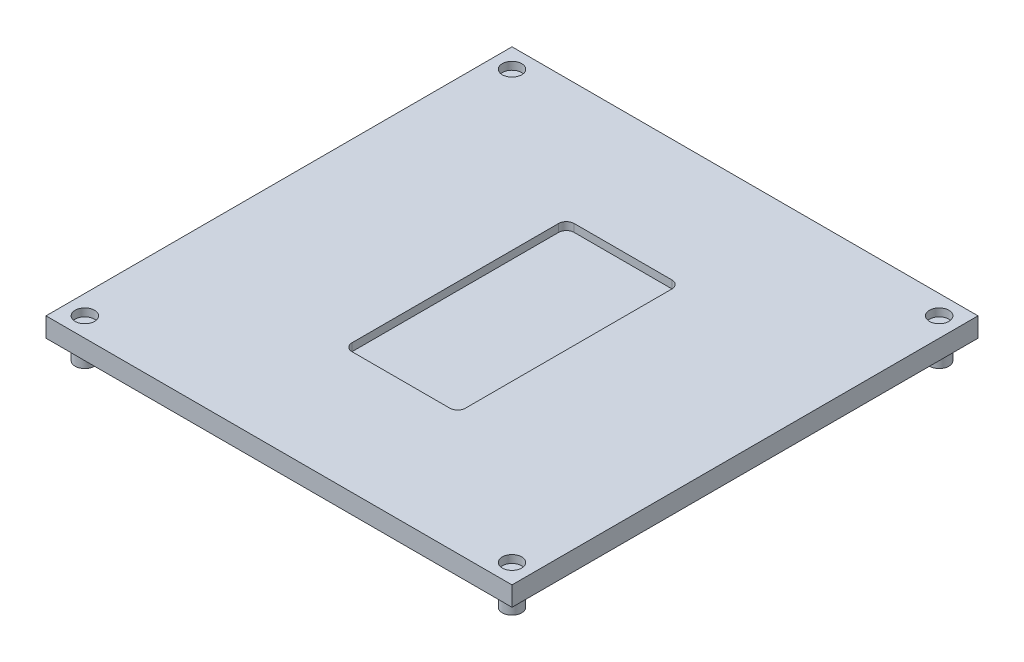
ISO-10303-21;
HEADER;
FILE_DESCRIPTION(('STEP AP214'),'2;1');
FILE_NAME('part.step','',(''),(''),'','','');
FILE_SCHEMA(('AUTOMOTIVE_DESIGN { 1 0 10303 214 1 1 1 1 }'));
ENDSEC;
DATA;
#1=APPLICATION_CONTEXT('core data for automotive mechanical design processes');
#2=APPLICATION_PROTOCOL_DEFINITION('international standard','automotive_design',2000,#1);
#3=PRODUCT_CONTEXT('',#1,'mechanical');
#4=PRODUCT('Part','Part','',(#3));
#5=PRODUCT_RELATED_PRODUCT_CATEGORY('part','',(#4));
#6=PRODUCT_DEFINITION_FORMATION('','',#4);
#7=PRODUCT_DEFINITION_CONTEXT('part definition',#1,'design');
#8=PRODUCT_DEFINITION('design','',#6,#7);
#9=PRODUCT_DEFINITION_SHAPE('','',#8);
#10=(LENGTH_UNIT() NAMED_UNIT(*) SI_UNIT(.MILLI.,.METRE.));
#11=(NAMED_UNIT(*) PLANE_ANGLE_UNIT() SI_UNIT($,.RADIAN.));
#12=(NAMED_UNIT(*) SI_UNIT($,.STERADIAN.) SOLID_ANGLE_UNIT());
#13=UNCERTAINTY_MEASURE_WITH_UNIT(LENGTH_MEASURE(1.E-05),#10,'distance_accuracy_value','');
#14=(GEOMETRIC_REPRESENTATION_CONTEXT(3) GLOBAL_UNCERTAINTY_ASSIGNED_CONTEXT((#13)) GLOBAL_UNIT_ASSIGNED_CONTEXT((#10,
#11,#12)) REPRESENTATION_CONTEXT('',''));
#15=CARTESIAN_POINT('',(0.,0.,0.));
#16=DIRECTION('',(0.,0.,1.));
#17=DIRECTION('',(1.,0.,0.));
#18=AXIS2_PLACEMENT_3D('',#15,#16,#17);
#19=CARTESIAN_POINT('',(17.2862696629214,3.81,8.9527865168539));
#20=DIRECTION('',(0.,1.,0.));
#21=DIRECTION('',(0.,0.,1.));
#22=AXIS2_PLACEMENT_3D('',#19,#20,#21);
#23=CYLINDRICAL_SURFACE('',#22,2.54);
#24=DIRECTION('',(0.,1.,0.));
#25=VECTOR('',#24,1.);
#26=CARTESIAN_POINT('',(19.8262696629214,3.81,8.9527865168539));
#27=LINE('',#26,#25);
#28=CARTESIAN_POINT('',(19.8262696629214,3.81,8.9527865168539));
#29=VERTEX_POINT('',#28);
#30=CARTESIAN_POINT('',(19.8262696629214,6.35,8.9527865168539));
#31=VERTEX_POINT('',#30);
#32=EDGE_CURVE('E204',#29,#31,#27,.T.);
#33=ORIENTED_EDGE('',*,*,#32,.F.);
#34=CARTESIAN_POINT('',(17.2862696629214,3.81,8.9527865168539));
#35=DIRECTION('',(0.,-1.,0.));
#36=DIRECTION('',(0.,0.,-1.));
#37=AXIS2_PLACEMENT_3D('',#34,#35,#36);
#38=CIRCLE('',#37,2.54);
#39=CARTESIAN_POINT('',(17.2862696629214,3.81,11.4927865168539));
#40=VERTEX_POINT('',#39);
#41=EDGE_CURVE('E49',#40,#29,#38,.F.);
#42=ORIENTED_EDGE('',*,*,#41,.F.);
#43=DIRECTION('',(0.,1.,0.));
#44=VECTOR('',#43,1.);
#45=CARTESIAN_POINT('',(17.2862696629214,3.81,11.4927865168539));
#46=LINE('',#45,#44);
#47=CARTESIAN_POINT('',(17.2862696629214,6.35,11.4927865168539));
#48=VERTEX_POINT('',#47);
#49=EDGE_CURVE('E208',#48,#40,#46,.F.);
#50=ORIENTED_EDGE('',*,*,#49,.F.);
#51=CARTESIAN_POINT('',(17.2862696629214,6.35,8.9527865168539));
#52=DIRECTION('',(0.,-1.,0.));
#53=DIRECTION('',(0.,0.,-1.));
#54=AXIS2_PLACEMENT_3D('',#51,#52,#53);
#55=CIRCLE('',#54,2.54);
#56=EDGE_CURVE('E11',#48,#31,#55,.F.);
#57=ORIENTED_EDGE('',*,*,#56,.T.);
#58=EDGE_LOOP('',(#33,#42,#50,#57));
#59=FACE_BOUND('',#58,.T.);
#60=ADVANCED_FACE('F41',(#59),#23,.F.);
#61=CARTESIAN_POINT('',(-14.7177303370786,3.81,8.9527865168539));
#62=DIRECTION('',(0.,1.,0.));
#63=DIRECTION('',(0.,0.,1.));
#64=AXIS2_PLACEMENT_3D('',#61,#62,#63);
#65=CYLINDRICAL_SURFACE('',#64,2.54);
#66=DIRECTION('',(0.,-1.,0.));
#67=VECTOR('',#66,1.);
#68=CARTESIAN_POINT('',(-17.2577303370786,3.81,8.9527865168539));
#69=LINE('',#68,#67);
#70=CARTESIAN_POINT('',(-17.2577303370786,6.35,8.9527865168539));
#71=VERTEX_POINT('',#70);
#72=CARTESIAN_POINT('',(-17.2577303370786,3.81,8.9527865168539));
#73=VERTEX_POINT('',#72);
#74=EDGE_CURVE('E190',#71,#73,#69,.T.);
#75=ORIENTED_EDGE('',*,*,#74,.F.);
#76=CARTESIAN_POINT('',(-14.7177303370786,6.35,8.9527865168539));
#77=DIRECTION('',(0.,-1.,0.));
#78=DIRECTION('',(0.,0.,-1.));
#79=AXIS2_PLACEMENT_3D('',#76,#77,#78);
#80=CIRCLE('',#79,2.54);
#81=CARTESIAN_POINT('',(-14.7177303370786,6.35,11.4927865168539));
#82=VERTEX_POINT('',#81);
#83=EDGE_CURVE('E201',#71,#82,#80,.F.);
#84=ORIENTED_EDGE('',*,*,#83,.T.);
#85=DIRECTION('',(0.,-1.,0.));
#86=VECTOR('',#85,1.);
#87=CARTESIAN_POINT('',(-14.7177303370786,3.81,11.4927865168539));
#88=LINE('',#87,#86);
#89=CARTESIAN_POINT('',(-14.7177303370786,3.81,11.4927865168539));
#90=VERTEX_POINT('',#89);
#91=EDGE_CURVE('E194',#90,#82,#88,.F.);
#92=ORIENTED_EDGE('',*,*,#91,.F.);
#93=CARTESIAN_POINT('',(-14.7177303370786,3.81,8.9527865168539));
#94=DIRECTION('',(0.,-1.,0.));
#95=DIRECTION('',(0.,0.,-1.));
#96=AXIS2_PLACEMENT_3D('',#93,#94,#95);
#97=CIRCLE('',#96,2.54);
#98=EDGE_CURVE('E198',#73,#90,#97,.F.);
#99=ORIENTED_EDGE('',*,*,#98,.F.);
#100=EDGE_LOOP('',(#75,#84,#92,#99));
#101=FACE_BOUND('',#100,.T.);
#102=ADVANCED_FACE('F351',(#101),#65,.F.);
#103=CARTESIAN_POINT('',(17.2862696629213,3.81,-58.6112134831461));
#104=DIRECTION('',(0.,-1.,0.));
#105=DIRECTION('',(0.,0.,-1.));
#106=AXIS2_PLACEMENT_3D('',#103,#104,#105);
#107=CYLINDRICAL_SURFACE('',#106,2.54);
#108=DIRECTION('',(0.,1.,0.));
#109=VECTOR('',#108,1.);
#110=CARTESIAN_POINT('',(17.2862696629213,3.81,-61.1512134831461));
#111=LINE('',#110,#109);
#112=CARTESIAN_POINT('',(17.2862696629213,3.81,-61.1512134831461));
#113=VERTEX_POINT('',#112);
#114=CARTESIAN_POINT('',(17.2862696629213,6.35,-61.1512134831461));
#115=VERTEX_POINT('',#114);
#116=EDGE_CURVE('E176',#113,#115,#111,.T.);
#117=ORIENTED_EDGE('',*,*,#116,.F.);
#118=CARTESIAN_POINT('',(17.2862696629213,3.81,-58.6112134831461));
#119=DIRECTION('',(0.,-1.,0.));
#120=DIRECTION('',(0.,0.,-1.));
#121=AXIS2_PLACEMENT_3D('',#118,#119,#120);
#122=CIRCLE('',#121,2.54);
#123=CARTESIAN_POINT('',(19.8262696629213,3.81,-58.6112134831461));
#124=VERTEX_POINT('',#123);
#125=EDGE_CURVE('E184',#124,#113,#122,.F.);
#126=ORIENTED_EDGE('',*,*,#125,.F.);
#127=DIRECTION('',(0.,1.,0.));
#128=VECTOR('',#127,1.);
#129=CARTESIAN_POINT('',(19.8262696629213,3.81,-58.6112134831461));
#130=LINE('',#129,#128);
#131=CARTESIAN_POINT('',(19.8262696629213,6.35,-58.6112134831461));
#132=VERTEX_POINT('',#131);
#133=EDGE_CURVE('E180',#132,#124,#130,.F.);
#134=ORIENTED_EDGE('',*,*,#133,.F.);
#135=CARTESIAN_POINT('',(17.2862696629213,6.35,-58.6112134831461));
#136=DIRECTION('',(0.,-1.,0.));
#137=DIRECTION('',(0.,0.,-1.));
#138=AXIS2_PLACEMENT_3D('',#135,#136,#137);
#139=CIRCLE('',#138,2.54);
#140=EDGE_CURVE('E187',#132,#115,#139,.F.);
#141=ORIENTED_EDGE('',*,*,#140,.T.);
#142=EDGE_LOOP('',(#117,#126,#134,#141));
#143=FACE_BOUND('',#142,.T.);
#144=ADVANCED_FACE('F355',(#143),#107,.F.);
#145=CARTESIAN_POINT('',(-14.7177303370786,3.81,-58.6112134831461));
#146=DIRECTION('',(0.,-1.,0.));
#147=DIRECTION('',(0.,0.,-1.));
#148=AXIS2_PLACEMENT_3D('',#145,#146,#147);
#149=CYLINDRICAL_SURFACE('',#148,2.54);
#150=DIRECTION('',(0.,-1.,0.));
#151=VECTOR('',#150,1.);
#152=CARTESIAN_POINT('',(-14.7177303370786,3.81,-61.1512134831461));
#153=LINE('',#152,#151);
#154=CARTESIAN_POINT('',(-14.7177303370786,6.35,-61.1512134831461));
#155=VERTEX_POINT('',#154);
#156=CARTESIAN_POINT('',(-14.7177303370786,3.81,-61.1512134831461));
#157=VERTEX_POINT('',#156);
#158=EDGE_CURVE('E156',#155,#157,#153,.T.);
#159=ORIENTED_EDGE('',*,*,#158,.F.);
#160=CARTESIAN_POINT('',(-14.7177303370786,6.35,-58.6112134831461));
#161=DIRECTION('',(0.,-1.,0.));
#162=DIRECTION('',(0.,0.,-1.));
#163=AXIS2_PLACEMENT_3D('',#160,#161,#162);
#164=CIRCLE('',#163,2.54);
#165=CARTESIAN_POINT('',(-17.2577303370786,6.35,-58.6112134831461));
#166=VERTEX_POINT('',#165);
#167=EDGE_CURVE('E173',#155,#166,#164,.F.);
#168=ORIENTED_EDGE('',*,*,#167,.T.);
#169=DIRECTION('',(0.,-1.,0.));
#170=VECTOR('',#169,1.);
#171=CARTESIAN_POINT('',(-17.2577303370786,3.81,-58.6112134831461));
#172=LINE('',#171,#170);
#173=CARTESIAN_POINT('',(-17.2577303370786,3.81,-58.6112134831461));
#174=VERTEX_POINT('',#173);
#175=EDGE_CURVE('E161',#174,#166,#172,.F.);
#176=ORIENTED_EDGE('',*,*,#175,.F.);
#177=CARTESIAN_POINT('',(-14.7177303370786,3.81,-58.6112134831461));
#178=DIRECTION('',(0.,-1.,0.));
#179=DIRECTION('',(0.,0.,-1.));
#180=AXIS2_PLACEMENT_3D('',#177,#178,#179);
#181=CIRCLE('',#180,2.54);
#182=EDGE_CURVE('E170',#157,#174,#181,.F.);
#183=ORIENTED_EDGE('',*,*,#182,.F.);
#184=EDGE_LOOP('',(#159,#168,#176,#183));
#185=FACE_BOUND('',#184,.T.);
#186=ADVANCED_FACE('F360',(#185),#149,.F.);
#187=CARTESIAN_POINT('',(-74.9157303370786,6.35,-101.029213483146));
#188=DIRECTION('',(1.,0.,0.));
#189=DIRECTION('',(0.,0.,-1.));
#190=AXIS2_PLACEMENT_3D('',#187,#188,#189);
#191=PLANE('',#190);
#192=DIRECTION('',(0.,0.,1.));
#193=VECTOR('',#192,1.);
#194=CARTESIAN_POINT('',(-74.9157303370786,0.,-101.029213483146));
#195=LINE('',#194,#193);
#196=CARTESIAN_POINT('',(-74.9157303370786,0.,-101.029213483146));
#197=VERTEX_POINT('',#196);
#198=CARTESIAN_POINT('',(-74.9157303370786,0.,51.3707865168539));
#199=VERTEX_POINT('',#198);
#200=EDGE_CURVE('E154',#197,#199,#195,.T.);
#201=ORIENTED_EDGE('',*,*,#200,.T.);
#202=DIRECTION('',(0.,-1.,0.));
#203=VECTOR('',#202,1.);
#204=CARTESIAN_POINT('',(-74.9157303370786,6.35,51.3707865168539));
#205=LINE('',#204,#203);
#206=CARTESIAN_POINT('',(-74.9157303370786,6.35,51.3707865168539));
#207=VERTEX_POINT('',#206);
#208=EDGE_CURVE('E132',#207,#199,#205,.T.);
#209=ORIENTED_EDGE('',*,*,#208,.F.);
#210=DIRECTION('',(0.,0.,1.));
#211=VECTOR('',#210,1.);
#212=CARTESIAN_POINT('',(-74.9157303370786,6.35,-101.029213483146));
#213=LINE('',#212,#211);
#214=CARTESIAN_POINT('',(-74.9157303370786,6.35,-101.029213483146));
#215=VERTEX_POINT('',#214);
#216=EDGE_CURVE('E140',#215,#207,#213,.T.);
#217=ORIENTED_EDGE('',*,*,#216,.F.);
#218=DIRECTION('',(0.,-1.,0.));
#219=VECTOR('',#218,1.);
#220=CARTESIAN_POINT('',(-74.9157303370786,6.35,-101.029213483146));
#221=LINE('',#220,#219);
#222=EDGE_CURVE('E319',#215,#197,#221,.T.);
#223=ORIENTED_EDGE('',*,*,#222,.T.);
#224=EDGE_LOOP('',(#201,#209,#217,#223));
#225=FACE_BOUND('',#224,.T.);
#226=ADVANCED_FACE('F152',(#225),#191,.F.);
#227=CARTESIAN_POINT('',(77.4842696629214,6.35,51.3707865168539));
#228=DIRECTION('',(0.,0.,-1.));
#229=DIRECTION('',(-1.,0.,0.));
#230=AXIS2_PLACEMENT_3D('',#227,#228,#229);
#231=PLANE('',#230);
#232=DIRECTION('',(1.,0.,0.));
#233=VECTOR('',#232,1.);
#234=CARTESIAN_POINT('',(77.4842696629214,0.,51.3707865168539));
#235=LINE('',#234,#233);
#236=CARTESIAN_POINT('',(77.4842696629214,0.,51.3707865168539));
#237=VERTEX_POINT('',#236);
#238=EDGE_CURVE('E322',#199,#237,#235,.T.);
#239=ORIENTED_EDGE('',*,*,#238,.T.);
#240=DIRECTION('',(0.,-1.,0.));
#241=VECTOR('',#240,1.);
#242=CARTESIAN_POINT('',(77.4842696629214,6.35,51.3707865168539));
#243=LINE('',#242,#241);
#244=CARTESIAN_POINT('',(77.4842696629214,6.35,51.3707865168539));
#245=VERTEX_POINT('',#244);
#246=EDGE_CURVE('E135',#245,#237,#243,.T.);
#247=ORIENTED_EDGE('',*,*,#246,.F.);
#248=DIRECTION('',(1.,0.,0.));
#249=VECTOR('',#248,1.);
#250=CARTESIAN_POINT('',(77.4842696629214,6.35,51.3707865168539));
#251=LINE('',#250,#249);
#252=EDGE_CURVE('E128',#207,#245,#251,.T.);
#253=ORIENTED_EDGE('',*,*,#252,.F.);
#254=ORIENTED_EDGE('',*,*,#208,.T.);
#255=EDGE_LOOP('',(#239,#247,#253,#254));
#256=FACE_BOUND('',#255,.T.);
#257=ADVANCED_FACE('F130',(#256),#231,.F.);
#258=CARTESIAN_POINT('',(77.4842696629214,6.35,-101.029213483146));
#259=DIRECTION('',(-1.,0.,0.));
#260=DIRECTION('',(0.,0.,1.));
#261=AXIS2_PLACEMENT_3D('',#258,#259,#260);
#262=PLANE('',#261);
#263=DIRECTION('',(0.,0.,-1.));
#264=VECTOR('',#263,1.);
#265=CARTESIAN_POINT('',(77.4842696629214,0.,-101.029213483146));
#266=LINE('',#265,#264);
#267=CARTESIAN_POINT('',(77.4842696629214,0.,-101.029213483146));
#268=VERTEX_POINT('',#267);
#269=EDGE_CURVE('E325',#237,#268,#266,.T.);
#270=ORIENTED_EDGE('',*,*,#269,.T.);
#271=DIRECTION('',(0.,-1.,0.));
#272=VECTOR('',#271,1.);
#273=CARTESIAN_POINT('',(77.4842696629214,6.35,-101.029213483146));
#274=LINE('',#273,#272);
#275=CARTESIAN_POINT('',(77.4842696629214,6.35,-101.029213483146));
#276=VERTEX_POINT('',#275);
#277=EDGE_CURVE('E163',#276,#268,#274,.T.);
#278=ORIENTED_EDGE('',*,*,#277,.F.);
#279=DIRECTION('',(0.,0.,-1.));
#280=VECTOR('',#279,1.);
#281=CARTESIAN_POINT('',(77.4842696629214,6.35,-101.029213483146));
#282=LINE('',#281,#280);
#283=EDGE_CURVE('E139',#245,#276,#282,.T.);
#284=ORIENTED_EDGE('',*,*,#283,.F.);
#285=ORIENTED_EDGE('',*,*,#246,.T.);
#286=EDGE_LOOP('',(#270,#278,#284,#285));
#287=FACE_BOUND('',#286,.T.);
#288=ADVANCED_FACE('F341',(#287),#262,.F.);
#289=CARTESIAN_POINT('',(77.4842696629214,6.35,-101.029213483146));
#290=DIRECTION('',(0.,0.,1.));
#291=DIRECTION('',(1.,0.,0.));
#292=AXIS2_PLACEMENT_3D('',#289,#290,#291);
#293=PLANE('',#292);
#294=DIRECTION('',(-1.,0.,0.));
#295=VECTOR('',#294,1.);
#296=CARTESIAN_POINT('',(77.4842696629214,0.,-101.029213483146));
#297=LINE('',#296,#295);
#298=EDGE_CURVE('E150',#268,#197,#297,.T.);
#299=ORIENTED_EDGE('',*,*,#298,.T.);
#300=ORIENTED_EDGE('',*,*,#222,.F.);
#301=DIRECTION('',(-1.,0.,0.));
#302=VECTOR('',#301,1.);
#303=CARTESIAN_POINT('',(77.4842696629214,6.35,-101.029213483146));
#304=LINE('',#303,#302);
#305=EDGE_CURVE('E145',#276,#215,#304,.T.);
#306=ORIENTED_EDGE('',*,*,#305,.F.);
#307=ORIENTED_EDGE('',*,*,#277,.T.);
#308=EDGE_LOOP('',(#299,#300,#306,#307));
#309=FACE_BOUND('',#308,.T.);
#310=ADVANCED_FACE('F336',(#309),#293,.F.);
#311=CARTESIAN_POINT('',(0.,6.35,0.));
#312=DIRECTION('',(0.,-1.,0.));
#313=DIRECTION('',(0.,0.,-1.));
#314=AXIS2_PLACEMENT_3D('',#311,#312,#313);
#315=PLANE('',#314);
#316=ORIENTED_EDGE('',*,*,#140,.F.);
#317=DIRECTION('',(0.,0.,1.));
#318=VECTOR('',#317,1.);
#319=CARTESIAN_POINT('',(19.8262696629213,6.35,-61.1512134831461));
#320=LINE('',#319,#318);
#321=EDGE_CURVE('E242',#132,#31,#320,.T.);
#322=ORIENTED_EDGE('',*,*,#321,.T.);
#323=ORIENTED_EDGE('',*,*,#56,.F.);
#324=DIRECTION('',(1.,0.,0.));
#325=VECTOR('',#324,1.);
#326=CARTESIAN_POINT('',(-17.2577303370786,6.35,11.4927865168539));
#327=LINE('',#326,#325);
#328=EDGE_CURVE('E238',#82,#48,#327,.T.);
#329=ORIENTED_EDGE('',*,*,#328,.F.);
#330=ORIENTED_EDGE('',*,*,#83,.F.);
#331=DIRECTION('',(0.,0.,1.));
#332=VECTOR('',#331,1.);
#333=CARTESIAN_POINT('',(-17.2577303370786,6.35,-61.1512134831461));
#334=LINE('',#333,#332);
#335=EDGE_CURVE('E231',#166,#71,#334,.T.);
#336=ORIENTED_EDGE('',*,*,#335,.F.);
#337=ORIENTED_EDGE('',*,*,#167,.F.);
#338=DIRECTION('',(1.,0.,0.));
#339=VECTOR('',#338,1.);
#340=CARTESIAN_POINT('',(-17.2577303370786,6.35,-61.1512134831461));
#341=LINE('',#340,#339);
#342=EDGE_CURVE('E245',#155,#115,#341,.T.);
#343=ORIENTED_EDGE('',*,*,#342,.T.);
#344=EDGE_LOOP('',(#316,#322,#323,#329,#330,#336,#337,#343));
#345=FACE_BOUND('',#344,.T.);
#346=CARTESIAN_POINT('',(71.1342696629214,6.35,-94.6792134831461));
#347=DIRECTION('',(0.,1.,0.));
#348=DIRECTION('',(0.,0.,1.));
#349=AXIS2_PLACEMENT_3D('',#346,#347,#348);
#350=CIRCLE('',#349,3.175);
#351=CARTESIAN_POINT('',(71.1342696629214,6.35,-91.5042134831461));
#352=VERTEX_POINT('',#351);
#353=EDGE_CURVE('E265',#352,#352,#350,.T.);
#354=ORIENTED_EDGE('',*,*,#353,.F.);
#355=EDGE_LOOP('',(#354));
#356=FACE_BOUND('',#355,.T.);
#357=CARTESIAN_POINT('',(-68.5657303370786,6.35,45.0207865168539));
#358=DIRECTION('',(0.,1.,0.));
#359=DIRECTION('',(0.,0.,1.));
#360=AXIS2_PLACEMENT_3D('',#357,#358,#359);
#361=CIRCLE('',#360,3.175);
#362=CARTESIAN_POINT('',(-68.5657303370786,6.35,48.1957865168539));
#363=VERTEX_POINT('',#362);
#364=EDGE_CURVE('E256',#363,#363,#361,.T.);
#365=ORIENTED_EDGE('',*,*,#364,.F.);
#366=EDGE_LOOP('',(#365));
#367=FACE_BOUND('',#366,.T.);
#368=CARTESIAN_POINT('',(71.1342696629214,6.35,45.0207865168539));
#369=DIRECTION('',(0.,1.,0.));
#370=DIRECTION('',(0.,0.,1.));
#371=AXIS2_PLACEMENT_3D('',#368,#369,#370);
#372=CIRCLE('',#371,3.175);
#373=CARTESIAN_POINT('',(71.1342696629214,6.35,48.1957865168539));
#374=VERTEX_POINT('',#373);
#375=EDGE_CURVE('E237',#374,#374,#372,.T.);
#376=ORIENTED_EDGE('',*,*,#375,.F.);
#377=EDGE_LOOP('',(#376));
#378=FACE_BOUND('',#377,.T.);
#379=CARTESIAN_POINT('',(-68.5657303370786,6.35,-94.6792134831461));
#380=DIRECTION('',(0.,1.,0.));
#381=DIRECTION('',(0.,0.,1.));
#382=AXIS2_PLACEMENT_3D('',#379,#380,#381);
#383=CIRCLE('',#382,3.175);
#384=CARTESIAN_POINT('',(-68.5657303370786,6.35,-91.5042134831461));
#385=VERTEX_POINT('',#384);
#386=EDGE_CURVE('E264',#385,#385,#383,.T.);
#387=ORIENTED_EDGE('',*,*,#386,.F.);
#388=EDGE_LOOP('',(#387));
#389=FACE_BOUND('',#388,.T.);
#390=ORIENTED_EDGE('',*,*,#216,.T.);
#391=ORIENTED_EDGE('',*,*,#252,.T.);
#392=ORIENTED_EDGE('',*,*,#283,.T.);
#393=ORIENTED_EDGE('',*,*,#305,.T.);
#394=EDGE_LOOP('',(#390,#391,#392,#393));
#395=FACE_BOUND('',#394,.T.);
#396=ADVANCED_FACE('F143',(#345,#356,#367,#378,#389,#395),#315,.F.);
#397=CARTESIAN_POINT('',(0.,0.,0.));
#398=DIRECTION('',(0.,-1.,0.));
#399=DIRECTION('',(0.,0.,-1.));
#400=AXIS2_PLACEMENT_3D('',#397,#398,#399);
#401=PLANE('',#400);
#402=CARTESIAN_POINT('',(71.1342696629214,0.,45.0207865168539));
#403=DIRECTION('',(0.,-1.,0.));
#404=DIRECTION('',(0.,0.,-1.));
#405=AXIS2_PLACEMENT_3D('',#402,#403,#404);
#406=CIRCLE('',#405,3.175);
#407=CARTESIAN_POINT('',(71.1342696629214,0.,41.8457865168539));
#408=VERTEX_POINT('',#407);
#409=EDGE_CURVE('E280',#408,#408,#406,.T.);
#410=ORIENTED_EDGE('',*,*,#409,.F.);
#411=EDGE_LOOP('',(#410));
#412=FACE_BOUND('',#411,.T.);
#413=CARTESIAN_POINT('',(-68.5657303370786,0.,45.0207865168539));
#414=DIRECTION('',(0.,-1.,0.));
#415=DIRECTION('',(0.,0.,-1.));
#416=AXIS2_PLACEMENT_3D('',#413,#414,#415);
#417=CIRCLE('',#416,3.175);
#418=CARTESIAN_POINT('',(-68.5657303370786,0.,41.8457865168539));
#419=VERTEX_POINT('',#418);
#420=EDGE_CURVE('E288',#419,#419,#417,.T.);
#421=ORIENTED_EDGE('',*,*,#420,.F.);
#422=EDGE_LOOP('',(#421));
#423=FACE_BOUND('',#422,.T.);
#424=CARTESIAN_POINT('',(-68.5657303370786,0.,-94.6792134831461));
#425=DIRECTION('',(0.,-1.,0.));
#426=DIRECTION('',(0.,0.,-1.));
#427=AXIS2_PLACEMENT_3D('',#424,#425,#426);
#428=CIRCLE('',#427,3.175);
#429=CARTESIAN_POINT('',(-68.5657303370786,0.,-97.8542134831461));
#430=VERTEX_POINT('',#429);
#431=EDGE_CURVE('E296',#430,#430,#428,.T.);
#432=ORIENTED_EDGE('',*,*,#431,.F.);
#433=EDGE_LOOP('',(#432));
#434=FACE_BOUND('',#433,.T.);
#435=CARTESIAN_POINT('',(71.1342696629214,0.,-94.6792134831461));
#436=DIRECTION('',(0.,-1.,0.));
#437=DIRECTION('',(0.,0.,-1.));
#438=AXIS2_PLACEMENT_3D('',#435,#436,#437);
#439=CIRCLE('',#438,3.175);
#440=CARTESIAN_POINT('',(71.1342696629214,0.,-97.8542134831461));
#441=VERTEX_POINT('',#440);
#442=EDGE_CURVE('E304',#441,#441,#439,.T.);
#443=ORIENTED_EDGE('',*,*,#442,.F.);
#444=EDGE_LOOP('',(#443));
#445=FACE_BOUND('',#444,.T.);
#446=ORIENTED_EDGE('',*,*,#200,.F.);
#447=ORIENTED_EDGE('',*,*,#298,.F.);
#448=ORIENTED_EDGE('',*,*,#269,.F.);
#449=ORIENTED_EDGE('',*,*,#238,.F.);
#450=EDGE_LOOP('',(#446,#447,#448,#449));
#451=FACE_BOUND('',#450,.T.);
#452=ADVANCED_FACE('F340',(#412,#423,#434,#445,#451),#401,.T.);
#453=CARTESIAN_POINT('',(71.1342696629214,-6.35,-94.6792134831461));
#454=DIRECTION('',(0.,1.,0.));
#455=DIRECTION('',(0.,0.,1.));
#456=AXIS2_PLACEMENT_3D('',#453,#454,#455);
#457=CYLINDRICAL_SURFACE('',#456,3.175);
#458=CARTESIAN_POINT('',(71.1342696629214,-6.35,-94.6792134831461));
#459=DIRECTION('',(0.,-1.,0.));
#460=DIRECTION('',(0.,0.,-1.));
#461=AXIS2_PLACEMENT_3D('',#458,#459,#460);
#462=CIRCLE('',#461,3.175);
#463=CARTESIAN_POINT('',(71.1342696629214,-6.35,-97.8542134831461));
#464=VERTEX_POINT('',#463);
#465=EDGE_CURVE('E308',#464,#464,#462,.T.);
#466=ORIENTED_EDGE('',*,*,#465,.F.);
#467=EDGE_LOOP('',(#466));
#468=FACE_BOUND('',#467,.T.);
#469=ORIENTED_EDGE('',*,*,#442,.T.);
#470=EDGE_LOOP('',(#469));
#471=FACE_BOUND('',#470,.T.);
#472=ADVANCED_FACE('F398',(#468,#471),#457,.T.);
#473=CARTESIAN_POINT('',(0.,-6.35,0.));
#474=DIRECTION('',(0.,-1.,0.));
#475=DIRECTION('',(0.,0.,-1.));
#476=AXIS2_PLACEMENT_3D('',#473,#474,#475);
#477=PLANE('',#476);
#478=ORIENTED_EDGE('',*,*,#465,.T.);
#479=EDGE_LOOP('',(#478));
#480=FACE_BOUND('',#479,.T.);
#481=ADVANCED_FACE('F408',(#480),#477,.T.);
#482=CARTESIAN_POINT('',(-68.5657303370786,-6.35,-94.6792134831461));
#483=DIRECTION('',(0.,1.,0.));
#484=DIRECTION('',(0.,0.,1.));
#485=AXIS2_PLACEMENT_3D('',#482,#483,#484);
#486=CYLINDRICAL_SURFACE('',#485,3.175);
#487=CARTESIAN_POINT('',(-68.5657303370786,-6.35,-94.6792134831461));
#488=DIRECTION('',(0.,-1.,0.));
#489=DIRECTION('',(0.,0.,-1.));
#490=AXIS2_PLACEMENT_3D('',#487,#488,#489);
#491=CIRCLE('',#490,3.175);
#492=CARTESIAN_POINT('',(-68.5657303370786,-6.35,-97.8542134831461));
#493=VERTEX_POINT('',#492);
#494=EDGE_CURVE('E300',#493,#493,#491,.T.);
#495=ORIENTED_EDGE('',*,*,#494,.F.);
#496=EDGE_LOOP('',(#495));
#497=FACE_BOUND('',#496,.T.);
#498=ORIENTED_EDGE('',*,*,#431,.T.);
#499=EDGE_LOOP('',(#498));
#500=FACE_BOUND('',#499,.T.);
#501=ADVANCED_FACE('F419',(#497,#500),#486,.T.);
#502=CARTESIAN_POINT('',(0.,-6.35,0.));
#503=DIRECTION('',(0.,-1.,0.));
#504=DIRECTION('',(0.,0.,-1.));
#505=AXIS2_PLACEMENT_3D('',#502,#503,#504);
#506=PLANE('',#505);
#507=ORIENTED_EDGE('',*,*,#494,.T.);
#508=EDGE_LOOP('',(#507));
#509=FACE_BOUND('',#508,.T.);
#510=ADVANCED_FACE('F429',(#509),#506,.T.);
#511=CARTESIAN_POINT('',(-68.5657303370786,-6.35,45.0207865168539));
#512=DIRECTION('',(0.,1.,0.));
#513=DIRECTION('',(0.,0.,1.));
#514=AXIS2_PLACEMENT_3D('',#511,#512,#513);
#515=CYLINDRICAL_SURFACE('',#514,3.175);
#516=CARTESIAN_POINT('',(-68.5657303370786,-6.35,45.0207865168539));
#517=DIRECTION('',(0.,-1.,0.));
#518=DIRECTION('',(0.,0.,-1.));
#519=AXIS2_PLACEMENT_3D('',#516,#517,#518);
#520=CIRCLE('',#519,3.175);
#521=CARTESIAN_POINT('',(-68.5657303370786,-6.35,41.8457865168539));
#522=VERTEX_POINT('',#521);
#523=EDGE_CURVE('E292',#522,#522,#520,.T.);
#524=ORIENTED_EDGE('',*,*,#523,.F.);
#525=EDGE_LOOP('',(#524));
#526=FACE_BOUND('',#525,.T.);
#527=ORIENTED_EDGE('',*,*,#420,.T.);
#528=EDGE_LOOP('',(#527));
#529=FACE_BOUND('',#528,.T.);
#530=ADVANCED_FACE('F440',(#526,#529),#515,.T.);
#531=CARTESIAN_POINT('',(0.,-6.35,0.));
#532=DIRECTION('',(0.,-1.,0.));
#533=DIRECTION('',(0.,0.,-1.));
#534=AXIS2_PLACEMENT_3D('',#531,#532,#533);
#535=PLANE('',#534);
#536=ORIENTED_EDGE('',*,*,#523,.T.);
#537=EDGE_LOOP('',(#536));
#538=FACE_BOUND('',#537,.T.);
#539=ADVANCED_FACE('F450',(#538),#535,.T.);
#540=CARTESIAN_POINT('',(71.1342696629214,-6.35,45.0207865168539));
#541=DIRECTION('',(0.,1.,0.));
#542=DIRECTION('',(0.,0.,1.));
#543=AXIS2_PLACEMENT_3D('',#540,#541,#542);
#544=CYLINDRICAL_SURFACE('',#543,3.175);
#545=CARTESIAN_POINT('',(71.1342696629214,-6.35,45.0207865168539));
#546=DIRECTION('',(0.,-1.,0.));
#547=DIRECTION('',(0.,0.,-1.));
#548=AXIS2_PLACEMENT_3D('',#545,#546,#547);
#549=CIRCLE('',#548,3.175);
#550=CARTESIAN_POINT('',(71.1342696629214,-6.35,41.8457865168539));
#551=VERTEX_POINT('',#550);
#552=EDGE_CURVE('E284',#551,#551,#549,.T.);
#553=ORIENTED_EDGE('',*,*,#552,.F.);
#554=EDGE_LOOP('',(#553));
#555=FACE_BOUND('',#554,.T.);
#556=ORIENTED_EDGE('',*,*,#409,.T.);
#557=EDGE_LOOP('',(#556));
#558=FACE_BOUND('',#557,.T.);
#559=ADVANCED_FACE('F461',(#555,#558),#544,.T.);
#560=CARTESIAN_POINT('',(0.,-6.35,0.));
#561=DIRECTION('',(0.,-1.,0.));
#562=DIRECTION('',(0.,0.,-1.));
#563=AXIS2_PLACEMENT_3D('',#560,#561,#562);
#564=PLANE('',#563);
#565=ORIENTED_EDGE('',*,*,#552,.T.);
#566=EDGE_LOOP('',(#565));
#567=FACE_BOUND('',#566,.T.);
#568=ADVANCED_FACE('F471',(#567),#564,.T.);
#569=CARTESIAN_POINT('',(-68.5657303370786,3.81,-94.6792134831461));
#570=DIRECTION('',(0.,1.,0.));
#571=DIRECTION('',(0.,0.,1.));
#572=AXIS2_PLACEMENT_3D('',#569,#570,#571);
#573=CYLINDRICAL_SURFACE('',#572,3.175);
#574=CARTESIAN_POINT('',(-68.5657303370786,3.81,-94.6792134831461));
#575=DIRECTION('',(0.,1.,0.));
#576=DIRECTION('',(0.,0.,1.));
#577=AXIS2_PLACEMENT_3D('',#574,#575,#576);
#578=CIRCLE('',#577,3.175);
#579=CARTESIAN_POINT('',(-68.5657303370786,3.81,-91.5042134831461));
#580=VERTEX_POINT('',#579);
#581=EDGE_CURVE('E276',#580,#580,#578,.T.);
#582=ORIENTED_EDGE('',*,*,#581,.F.);
#583=EDGE_LOOP('',(#582));
#584=FACE_BOUND('',#583,.T.);
#585=ORIENTED_EDGE('',*,*,#386,.T.);
#586=EDGE_LOOP('',(#585));
#587=FACE_BOUND('',#586,.T.);
#588=ADVANCED_FACE('F482',(#584,#587),#573,.F.);
#589=CARTESIAN_POINT('',(-68.5657303370786,3.81,-94.6792134831461));
#590=DIRECTION('',(0.,1.,0.));
#591=DIRECTION('',(0.,0.,1.));
#592=AXIS2_PLACEMENT_3D('',#589,#590,#591);
#593=PLANE('',#592);
#594=ORIENTED_EDGE('',*,*,#581,.T.);
#595=EDGE_LOOP('',(#594));
#596=FACE_BOUND('',#595,.T.);
#597=ADVANCED_FACE('F492',(#596),#593,.T.);
#598=CARTESIAN_POINT('',(71.1342696629214,3.81,45.0207865168539));
#599=DIRECTION('',(0.,1.,0.));
#600=DIRECTION('',(0.,0.,1.));
#601=AXIS2_PLACEMENT_3D('',#598,#599,#600);
#602=CYLINDRICAL_SURFACE('',#601,3.175);
#603=CARTESIAN_POINT('',(71.1342696629214,3.81,45.0207865168539));
#604=DIRECTION('',(0.,1.,0.));
#605=DIRECTION('',(0.,0.,1.));
#606=AXIS2_PLACEMENT_3D('',#603,#604,#605);
#607=CIRCLE('',#606,3.175);
#608=CARTESIAN_POINT('',(71.1342696629214,3.81,48.1957865168539));
#609=VERTEX_POINT('',#608);
#610=EDGE_CURVE('E252',#609,#609,#607,.T.);
#611=ORIENTED_EDGE('',*,*,#610,.F.);
#612=EDGE_LOOP('',(#611));
#613=FACE_BOUND('',#612,.T.);
#614=ORIENTED_EDGE('',*,*,#375,.T.);
#615=EDGE_LOOP('',(#614));
#616=FACE_BOUND('',#615,.T.);
#617=ADVANCED_FACE('F502',(#613,#616),#602,.F.);
#618=CARTESIAN_POINT('',(71.1342696629214,3.81,45.0207865168539));
#619=DIRECTION('',(0.,1.,0.));
#620=DIRECTION('',(0.,0.,1.));
#621=AXIS2_PLACEMENT_3D('',#618,#619,#620);
#622=PLANE('',#621);
#623=ORIENTED_EDGE('',*,*,#610,.T.);
#624=EDGE_LOOP('',(#623));
#625=FACE_BOUND('',#624,.T.);
#626=ADVANCED_FACE('F512',(#625),#622,.T.);
#627=CARTESIAN_POINT('',(-68.5657303370786,3.81,45.0207865168539));
#628=DIRECTION('',(0.,1.,0.));
#629=DIRECTION('',(0.,0.,1.));
#630=AXIS2_PLACEMENT_3D('',#627,#628,#629);
#631=CYLINDRICAL_SURFACE('',#630,3.175);
#632=CARTESIAN_POINT('',(-68.5657303370786,3.81,45.0207865168539));
#633=DIRECTION('',(0.,1.,0.));
#634=DIRECTION('',(0.,0.,1.));
#635=AXIS2_PLACEMENT_3D('',#632,#633,#634);
#636=CIRCLE('',#635,3.175);
#637=CARTESIAN_POINT('',(-68.5657303370786,3.81,48.1957865168539));
#638=VERTEX_POINT('',#637);
#639=EDGE_CURVE('E269',#638,#638,#636,.T.);
#640=ORIENTED_EDGE('',*,*,#639,.F.);
#641=EDGE_LOOP('',(#640));
#642=FACE_BOUND('',#641,.T.);
#643=ORIENTED_EDGE('',*,*,#364,.T.);
#644=EDGE_LOOP('',(#643));
#645=FACE_BOUND('',#644,.T.);
#646=ADVANCED_FACE('F522',(#642,#645),#631,.F.);
#647=CARTESIAN_POINT('',(-68.5657303370786,3.81,45.0207865168539));
#648=DIRECTION('',(0.,1.,0.));
#649=DIRECTION('',(0.,0.,1.));
#650=AXIS2_PLACEMENT_3D('',#647,#648,#649);
#651=PLANE('',#650);
#652=ORIENTED_EDGE('',*,*,#639,.T.);
#653=EDGE_LOOP('',(#652));
#654=FACE_BOUND('',#653,.T.);
#655=ADVANCED_FACE('F532',(#654),#651,.T.);
#656=CARTESIAN_POINT('',(71.1342696629214,3.81,-94.6792134831461));
#657=DIRECTION('',(0.,1.,0.));
#658=DIRECTION('',(0.,0.,1.));
#659=AXIS2_PLACEMENT_3D('',#656,#657,#658);
#660=CYLINDRICAL_SURFACE('',#659,3.175);
#661=CARTESIAN_POINT('',(71.1342696629214,3.81,-94.6792134831461));
#662=DIRECTION('',(0.,1.,0.));
#663=DIRECTION('',(0.,0.,1.));
#664=AXIS2_PLACEMENT_3D('',#661,#662,#663);
#665=CIRCLE('',#664,3.175);
#666=CARTESIAN_POINT('',(71.1342696629214,3.81,-91.5042134831461));
#667=VERTEX_POINT('',#666);
#668=EDGE_CURVE('E260',#667,#667,#665,.T.);
#669=ORIENTED_EDGE('',*,*,#668,.F.);
#670=EDGE_LOOP('',(#669));
#671=FACE_BOUND('',#670,.T.);
#672=ORIENTED_EDGE('',*,*,#353,.T.);
#673=EDGE_LOOP('',(#672));
#674=FACE_BOUND('',#673,.T.);
#675=ADVANCED_FACE('F542',(#671,#674),#660,.F.);
#676=CARTESIAN_POINT('',(71.1342696629214,3.81,-94.6792134831461));
#677=DIRECTION('',(0.,1.,0.));
#678=DIRECTION('',(0.,0.,1.));
#679=AXIS2_PLACEMENT_3D('',#676,#677,#678);
#680=PLANE('',#679);
#681=ORIENTED_EDGE('',*,*,#668,.T.);
#682=EDGE_LOOP('',(#681));
#683=FACE_BOUND('',#682,.T.);
#684=ADVANCED_FACE('F552',(#683),#680,.T.);
#685=CARTESIAN_POINT('',(-17.2577303370786,3.81,11.4927865168539));
#686=DIRECTION('',(0.,0.,1.));
#687=DIRECTION('',(1.,0.,0.));
#688=AXIS2_PLACEMENT_3D('',#685,#686,#687);
#689=PLANE('',#688);
#690=ORIENTED_EDGE('',*,*,#328,.T.);
#691=ORIENTED_EDGE('',*,*,#49,.T.);
#692=DIRECTION('',(1.,0.,0.));
#693=VECTOR('',#692,1.);
#694=CARTESIAN_POINT('',(-17.2577303370786,3.81,11.4927865168539));
#695=LINE('',#694,#693);
#696=EDGE_CURVE('E218',#90,#40,#695,.T.);
#697=ORIENTED_EDGE('',*,*,#696,.F.);
#698=ORIENTED_EDGE('',*,*,#91,.T.);
#699=EDGE_LOOP('',(#690,#691,#697,#698));
#700=FACE_BOUND('',#699,.T.);
#701=ADVANCED_FACE('F561',(#700),#689,.F.);
#702=CARTESIAN_POINT('',(-17.2577303370786,3.81,-61.1512134831461));
#703=DIRECTION('',(-1.,0.,0.));
#704=DIRECTION('',(0.,0.,1.));
#705=AXIS2_PLACEMENT_3D('',#702,#703,#704);
#706=PLANE('',#705);
#707=ORIENTED_EDGE('',*,*,#335,.T.);
#708=ORIENTED_EDGE('',*,*,#74,.T.);
#709=DIRECTION('',(0.,0.,1.));
#710=VECTOR('',#709,1.);
#711=CARTESIAN_POINT('',(-17.2577303370786,3.81,-61.1512134831461));
#712=LINE('',#711,#710);
#713=EDGE_CURVE('E229',#174,#73,#712,.T.);
#714=ORIENTED_EDGE('',*,*,#713,.F.);
#715=ORIENTED_EDGE('',*,*,#175,.T.);
#716=EDGE_LOOP('',(#707,#708,#714,#715));
#717=FACE_BOUND('',#716,.T.);
#718=ADVANCED_FACE('F586',(#717),#706,.F.);
#719=CARTESIAN_POINT('',(-17.2577303370786,3.81,-61.1512134831461));
#720=DIRECTION('',(0.,0.,1.));
#721=DIRECTION('',(1.,0.,0.));
#722=AXIS2_PLACEMENT_3D('',#719,#720,#721);
#723=PLANE('',#722);
#724=DIRECTION('',(1.,0.,0.));
#725=VECTOR('',#724,1.);
#726=CARTESIAN_POINT('',(-17.2577303370786,3.81,-61.1512134831461));
#727=LINE('',#726,#725);
#728=EDGE_CURVE('E224',#157,#113,#727,.T.);
#729=ORIENTED_EDGE('',*,*,#728,.T.);
#730=ORIENTED_EDGE('',*,*,#116,.T.);
#731=ORIENTED_EDGE('',*,*,#342,.F.);
#732=ORIENTED_EDGE('',*,*,#158,.T.);
#733=EDGE_LOOP('',(#729,#730,#731,#732));
#734=FACE_BOUND('',#733,.T.);
#735=ADVANCED_FACE('F582',(#734),#723,.T.);
#736=CARTESIAN_POINT('',(19.8262696629213,3.81,-61.1512134831461));
#737=DIRECTION('',(-1.,0.,0.));
#738=DIRECTION('',(0.,0.,1.));
#739=AXIS2_PLACEMENT_3D('',#736,#737,#738);
#740=PLANE('',#739);
#741=DIRECTION('',(0.,0.,1.));
#742=VECTOR('',#741,1.);
#743=CARTESIAN_POINT('',(19.8262696629213,3.81,-61.1512134831461));
#744=LINE('',#743,#742);
#745=EDGE_CURVE('E216',#124,#29,#744,.T.);
#746=ORIENTED_EDGE('',*,*,#745,.T.);
#747=ORIENTED_EDGE('',*,*,#32,.T.);
#748=ORIENTED_EDGE('',*,*,#321,.F.);
#749=ORIENTED_EDGE('',*,*,#133,.T.);
#750=EDGE_LOOP('',(#746,#747,#748,#749));
#751=FACE_BOUND('',#750,.T.);
#752=ADVANCED_FACE('F221',(#751),#740,.T.);
#753=CARTESIAN_POINT('',(0.,3.81,0.));
#754=DIRECTION('',(0.,-1.,0.));
#755=DIRECTION('',(0.,0.,-1.));
#756=AXIS2_PLACEMENT_3D('',#753,#754,#755);
#757=PLANE('',#756);
#758=ORIENTED_EDGE('',*,*,#696,.T.);
#759=ORIENTED_EDGE('',*,*,#41,.T.);
#760=ORIENTED_EDGE('',*,*,#745,.F.);
#761=ORIENTED_EDGE('',*,*,#125,.T.);
#762=ORIENTED_EDGE('',*,*,#728,.F.);
#763=ORIENTED_EDGE('',*,*,#182,.T.);
#764=ORIENTED_EDGE('',*,*,#713,.T.);
#765=ORIENTED_EDGE('',*,*,#98,.T.);
#766=EDGE_LOOP('',(#758,#759,#760,#761,#762,#763,#764,#765));
#767=FACE_BOUND('',#766,.T.);
#768=ADVANCED_FACE('F214',(#767),#757,.F.);
#769=CLOSED_SHELL('',(#60,#102,#144,#186,#226,#257,#288,#310,#396,#452,#472,#481,#501,#510,#530,
#539,#559,#568,#588,#597,#617,#626,#646,#655,#675,#684,#701,#718,#735,#752,#768));
#770=MANIFOLD_SOLID_BREP('B2',#769);
#771=ADVANCED_BREP_SHAPE_REPRESENTATION('',(#18,#770),#14);
#772=SHAPE_DEFINITION_REPRESENTATION(#9,#771);
ENDSEC;
END-ISO-10303-21;
